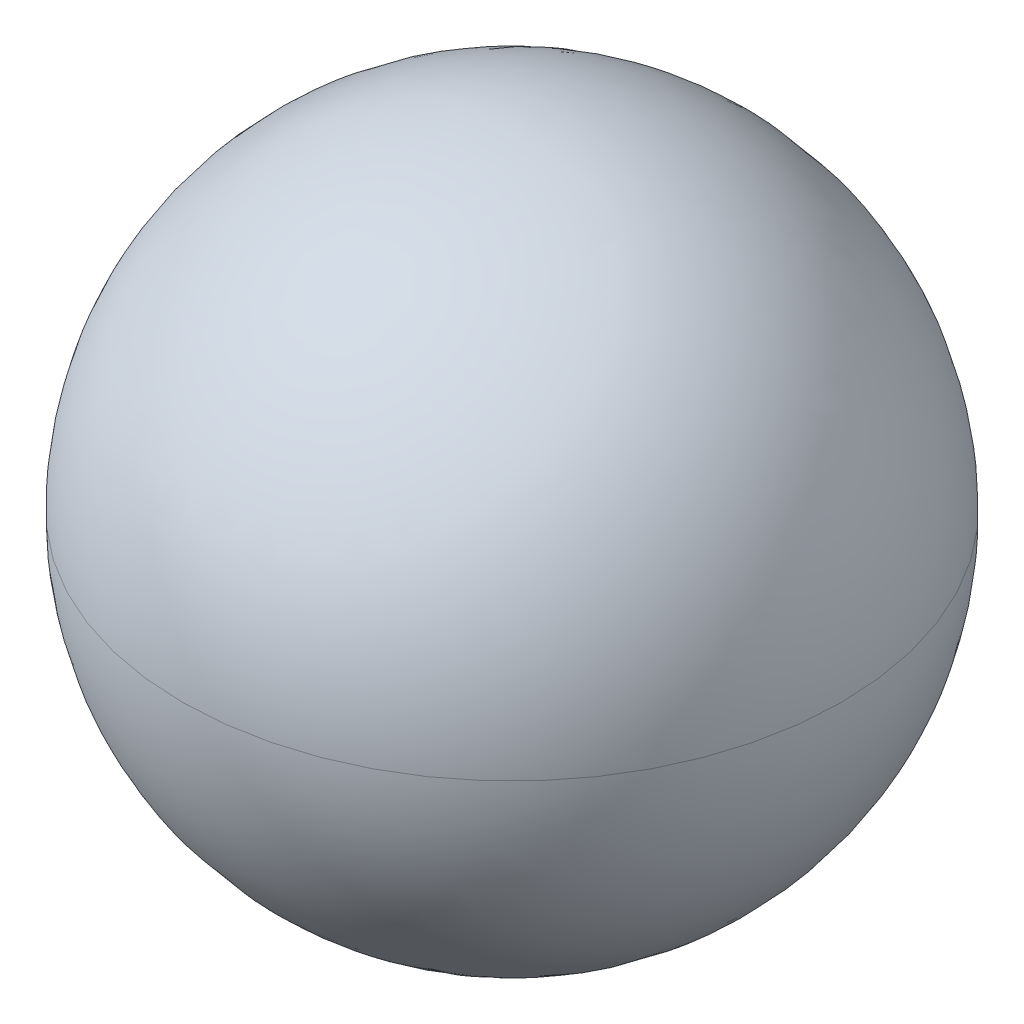
ISO-10303-21;
HEADER;
FILE_DESCRIPTION(('STEP AP214'),'2;1');
FILE_NAME('part.step','',(''),(''),'','','');
FILE_SCHEMA(('AUTOMOTIVE_DESIGN { 1 0 10303 214 1 1 1 1 }'));
ENDSEC;
DATA;
#1=APPLICATION_CONTEXT('core data for automotive mechanical design processes');
#2=APPLICATION_PROTOCOL_DEFINITION('international standard','automotive_design',2000,#1);
#3=PRODUCT_CONTEXT('',#1,'mechanical');
#4=PRODUCT('Part','Part','',(#3));
#5=PRODUCT_RELATED_PRODUCT_CATEGORY('part','',(#4));
#6=PRODUCT_DEFINITION_FORMATION('','',#4);
#7=PRODUCT_DEFINITION_CONTEXT('part definition',#1,'design');
#8=PRODUCT_DEFINITION('design','',#6,#7);
#9=PRODUCT_DEFINITION_SHAPE('','',#8);
#10=(LENGTH_UNIT() NAMED_UNIT(*) SI_UNIT(.MILLI.,.METRE.));
#11=(NAMED_UNIT(*) PLANE_ANGLE_UNIT() SI_UNIT($,.RADIAN.));
#12=(NAMED_UNIT(*) SI_UNIT($,.STERADIAN.) SOLID_ANGLE_UNIT());
#13=UNCERTAINTY_MEASURE_WITH_UNIT(LENGTH_MEASURE(1.E-05),#10,'distance_accuracy_value','');
#14=(GEOMETRIC_REPRESENTATION_CONTEXT(3) GLOBAL_UNCERTAINTY_ASSIGNED_CONTEXT((#13)) GLOBAL_UNIT_ASSIGNED_CONTEXT((#10,
#11,#12)) REPRESENTATION_CONTEXT('',''));
#15=CARTESIAN_POINT('',(0.,0.,0.));
#16=DIRECTION('',(0.,0.,1.));
#17=DIRECTION('',(1.,0.,0.));
#18=AXIS2_PLACEMENT_3D('',#15,#16,#17);
#19=CARTESIAN_POINT('',(45.379937912543,28.10024028048,1.346800003052));
#20=CARTESIAN_POINT('',(45.379937912543,28.10024028048,1.346800003052));
#21=CARTESIAN_POINT('',(45.379937912543,28.10024028048,1.346800003052));
#22=CARTESIAN_POINT('',(45.379937912543,28.10024028048,1.346800003052));
#23=CARTESIAN_POINT('',(45.379937912543,28.10024028048,1.034800003052));
#24=CARTESIAN_POINT('',(45.379937912543,27.47624028048,1.034800003052));
#25=CARTESIAN_POINT('',(45.379937912543,27.47624028048,1.658800003052));
#26=CARTESIAN_POINT('',(45.379937912543,28.10024028048,1.658800003052));
#27=CARTESIAN_POINT('',(45.691937912543,28.10024028048,1.034800003052));
#28=CARTESIAN_POINT('',(45.691937912543,27.47624028048,1.034800003052));
#29=CARTESIAN_POINT('',(45.691937912543,27.47624028048,1.658800003052));
#30=CARTESIAN_POINT('',(45.691937912543,28.10024028048,1.658800003052));
#31=CARTESIAN_POINT('',(45.691937912543,28.10024028048,1.346800003052));
#32=CARTESIAN_POINT('',(45.691937912543,28.10024028048,1.346800003052));
#33=CARTESIAN_POINT('',(45.691937912543,28.10024028048,1.346800003052));
#34=CARTESIAN_POINT('',(45.691937912543,28.10024028048,1.346800003052));
#35=(BOUNDED_SURFACE() B_SPLINE_SURFACE(3,3,((#19,#20,#21,#22),(#23,#24,#25,#26),(#27,#28,#29,
#30),(#31,#32,#33,#34)),.UNSPECIFIED.,.F.,.F.,.F.) B_SPLINE_SURFACE_WITH_KNOTS((4,4),(4,4),(0.,
1.),(0.,1.),.UNSPECIFIED.) GEOMETRIC_REPRESENTATION_ITEM() RATIONAL_B_SPLINE_SURFACE(((1.,
0.333333333333,0.333333333333,1.),(0.333333333333,0.111111111111,0.111111111111,0.333333333333),
(0.333333333333,0.111111111111,0.111111111111,0.333333333333),(1.,0.333333333333,0.333333333333,1.))) REPRESENTATION_ITEM('') SURFACE());
#36=CARTESIAN_POINT('',(45.535937912543,28.10024028048,1.346800003052));
#37=DIRECTION('',(0.,1.,0.));
#38=DIRECTION('',(-1.,0.,0.));
#39=AXIS2_PLACEMENT_3D('',#36,#37,#38);
#40=CIRCLE('',#39,0.156);
#41=CARTESIAN_POINT('',(45.379937912543,28.10024028048,1.346800003052));
#42=VERTEX_POINT('',#41);
#43=CARTESIAN_POINT('',(45.691937912543,28.10024028048,1.346800003052));
#44=VERTEX_POINT('',#43);
#45=EDGE_CURVE('E11',#42,#44,#40,.T.);
#46=CARTESIAN_POINT('',(45.535937912543,28.10024028048,1.346800003052));
#47=DIRECTION('',(0.,-1.,0.));
#48=DIRECTION('',(-1.,0.,0.));
#49=AXIS2_PLACEMENT_3D('',#46,#47,#48);
#50=CIRCLE('',#49,0.156);
#51=EDGE_CURVE('E28',#42,#44,#50,.T.);
#52=ORIENTED_EDGE('',*,*,#45,.F.);
#53=ORIENTED_EDGE('',*,*,#51,.T.);
#54=EDGE_LOOP('',(#52,#53));
#55=FACE_BOUND('',#54,.T.);
#56=ADVANCED_FACE('F17',(#55),#35,.T.);
#57=CARTESIAN_POINT('',(45.379937912543,28.10024028048,1.346800003052));
#58=CARTESIAN_POINT('',(45.379937912543,28.10024028048,1.346800003052));
#59=CARTESIAN_POINT('',(45.379937912543,28.10024028048,1.346800003052));
#60=CARTESIAN_POINT('',(45.379937912543,28.10024028048,1.346800003052));
#61=CARTESIAN_POINT('',(45.379937912543,28.10024028048,1.658800003052));
#62=CARTESIAN_POINT('',(45.379937912543,28.72424028048,1.658800003052));
#63=CARTESIAN_POINT('',(45.379937912543,28.72424028048,1.034800003052));
#64=CARTESIAN_POINT('',(45.379937912543,28.10024028048,1.034800003052));
#65=CARTESIAN_POINT('',(45.691937912543,28.10024028048,1.658800003052));
#66=CARTESIAN_POINT('',(45.691937912543,28.72424028048,1.658800003052));
#67=CARTESIAN_POINT('',(45.691937912543,28.72424028048,1.034800003052));
#68=CARTESIAN_POINT('',(45.691937912543,28.10024028048,1.034800003052));
#69=CARTESIAN_POINT('',(45.691937912543,28.10024028048,1.346800003052));
#70=CARTESIAN_POINT('',(45.691937912543,28.10024028048,1.346800003052));
#71=CARTESIAN_POINT('',(45.691937912543,28.10024028048,1.346800003052));
#72=CARTESIAN_POINT('',(45.691937912543,28.10024028048,1.346800003052));
#73=(BOUNDED_SURFACE() B_SPLINE_SURFACE(3,3,((#57,#58,#59,#60),(#61,#62,#63,#64),(#65,#66,#67,
#68),(#69,#70,#71,#72)),.UNSPECIFIED.,.F.,.F.,.F.) B_SPLINE_SURFACE_WITH_KNOTS((4,4),(4,4),(0.,
1.),(0.,1.),.UNSPECIFIED.) GEOMETRIC_REPRESENTATION_ITEM() RATIONAL_B_SPLINE_SURFACE(((1.,
0.333333333333,0.333333333333,1.),(0.333333333333,0.111111111111,0.111111111111,0.333333333333),
(0.333333333333,0.111111111111,0.111111111111,0.333333333333),(1.,0.333333333333,0.333333333333,1.))) REPRESENTATION_ITEM('') SURFACE());
#74=ORIENTED_EDGE('',*,*,#51,.F.);
#75=ORIENTED_EDGE('',*,*,#45,.T.);
#76=EDGE_LOOP('',(#74,#75));
#77=FACE_BOUND('',#76,.T.);
#78=ADVANCED_FACE('F19',(#77),#73,.T.);
#79=CLOSED_SHELL('',(#56,#78));
#80=MANIFOLD_SOLID_BREP('B1',#79);
#81=ADVANCED_BREP_SHAPE_REPRESENTATION('',(#18,#80),#14);
#82=SHAPE_DEFINITION_REPRESENTATION(#9,#81);
ENDSEC;
END-ISO-10303-21;
